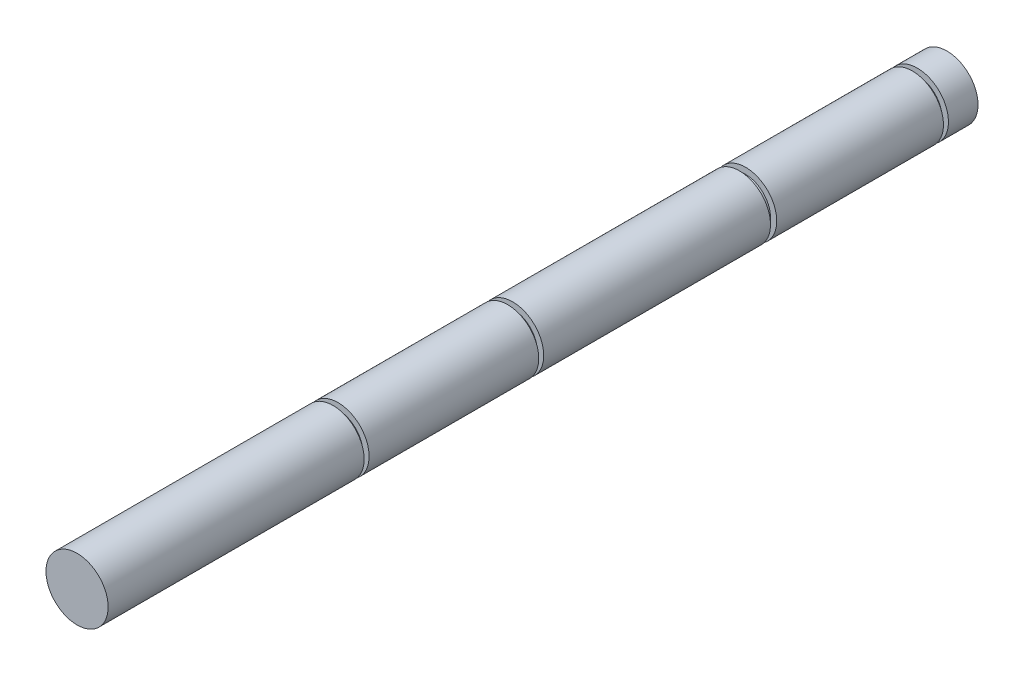
ISO-10303-21;
HEADER;
FILE_DESCRIPTION(('STEP AP214'),'2;1');
FILE_NAME('part.step','',(''),(''),'','','');
FILE_SCHEMA(('AUTOMOTIVE_DESIGN { 1 0 10303 214 1 1 1 1 }'));
ENDSEC;
DATA;
#1=APPLICATION_CONTEXT('core data for automotive mechanical design processes');
#2=APPLICATION_PROTOCOL_DEFINITION('international standard','automotive_design',2000,#1);
#3=PRODUCT_CONTEXT('',#1,'mechanical');
#4=PRODUCT('Part','Part','',(#3));
#5=PRODUCT_RELATED_PRODUCT_CATEGORY('part','',(#4));
#6=PRODUCT_DEFINITION_FORMATION('','',#4);
#7=PRODUCT_DEFINITION_CONTEXT('part definition',#1,'design');
#8=PRODUCT_DEFINITION('design','',#6,#7);
#9=PRODUCT_DEFINITION_SHAPE('','',#8);
#10=(LENGTH_UNIT() NAMED_UNIT(*) SI_UNIT(.MILLI.,.METRE.));
#11=(NAMED_UNIT(*) PLANE_ANGLE_UNIT() SI_UNIT($,.RADIAN.));
#12=(NAMED_UNIT(*) SI_UNIT($,.STERADIAN.) SOLID_ANGLE_UNIT());
#13=UNCERTAINTY_MEASURE_WITH_UNIT(LENGTH_MEASURE(1.E-05),#10,'distance_accuracy_value','');
#14=(GEOMETRIC_REPRESENTATION_CONTEXT(3) GLOBAL_UNCERTAINTY_ASSIGNED_CONTEXT((#13)) GLOBAL_UNIT_ASSIGNED_CONTEXT((#10,
#11,#12)) REPRESENTATION_CONTEXT('',''));
#15=CARTESIAN_POINT('',(0.,0.,0.));
#16=DIRECTION('',(0.,0.,1.));
#17=DIRECTION('',(1.,0.,0.));
#18=AXIS2_PLACEMENT_3D('',#15,#16,#17);
#19=CARTESIAN_POINT('',(0.,0.,135.));
#20=DIRECTION('',(0.,0.,-1.));
#21=DIRECTION('',(-1.,0.,0.));
#22=AXIS2_PLACEMENT_3D('',#19,#20,#21);
#23=CYLINDRICAL_SURFACE('',#22,5.);
#24=CARTESIAN_POINT('',(0.,0.,64.9));
#25=DIRECTION('',(0.,0.,-1.));
#26=DIRECTION('',(-1.,0.,0.));
#27=AXIS2_PLACEMENT_3D('',#24,#25,#26);
#28=CIRCLE('',#27,5.);
#29=CARTESIAN_POINT('',(-5.,0.,64.9));
#30=VERTEX_POINT('',#29);
#31=EDGE_CURVE('E68',#30,#30,#28,.T.);
#32=ORIENTED_EDGE('',*,*,#31,.T.);
#33=EDGE_LOOP('',(#32));
#34=FACE_BOUND('',#33,.T.);
#35=CARTESIAN_POINT('',(2.55336168158573E-12,9.43764535068018E-13,28.3999999999994));
#36=DIRECTION('',(0.,0.,-1.));
#37=DIRECTION('',(-1.,0.,0.));
#38=AXIS2_PLACEMENT_3D('',#35,#36,#37);
#39=CIRCLE('',#38,4.99999999997957);
#40=CARTESIAN_POINT('',(-4.99999999997702,9.43764535068018E-13,28.3999999999994));
#41=VERTEX_POINT('',#40);
#42=EDGE_CURVE('E89',#41,#41,#39,.T.);
#43=ORIENTED_EDGE('',*,*,#42,.F.);
#44=EDGE_LOOP('',(#43));
#45=FACE_BOUND('',#44,.T.);
#46=ADVANCED_FACE('F37',(#34,#45),#23,.T.);
#47=CARTESIAN_POINT('',(-5.,0.,65.7));
#48=DIRECTION('',(0.,0.,1.));
#49=DIRECTION('',(1.,0.,0.));
#50=AXIS2_PLACEMENT_3D('',#47,#48,#49);
#51=PLANE('',#50);
#52=CARTESIAN_POINT('',(0.,0.,65.7));
#53=DIRECTION('',(0.,0.,-1.));
#54=DIRECTION('',(-1.,0.,0.));
#55=AXIS2_PLACEMENT_3D('',#52,#53,#54);
#56=CIRCLE('',#55,4.);
#57=CARTESIAN_POINT('',(-4.,0.,65.7));
#58=VERTEX_POINT('',#57);
#59=EDGE_CURVE('E48',#58,#58,#56,.T.);
#60=ORIENTED_EDGE('',*,*,#59,.F.);
#61=EDGE_LOOP('',(#60));
#62=FACE_BOUND('',#61,.T.);
#63=CARTESIAN_POINT('',(0.,0.,65.7));
#64=DIRECTION('',(0.,0.,-1.));
#65=DIRECTION('',(-1.,0.,0.));
#66=AXIS2_PLACEMENT_3D('',#63,#64,#65);
#67=CIRCLE('',#66,5.);
#68=CARTESIAN_POINT('',(-5.,0.,65.7));
#69=VERTEX_POINT('',#68);
#70=EDGE_CURVE('E44',#69,#69,#67,.T.);
#71=ORIENTED_EDGE('',*,*,#70,.T.);
#72=EDGE_LOOP('',(#71));
#73=FACE_BOUND('',#72,.T.);
#74=ADVANCED_FACE('F115',(#62,#73),#51,.F.);
#75=CARTESIAN_POINT('',(0.,0.,6.05055330366506));
#76=DIRECTION('',(0.,0.,-1.));
#77=DIRECTION('',(-1.,0.,0.));
#78=AXIS2_PLACEMENT_3D('',#75,#76,#77);
#79=CYLINDRICAL_SURFACE('',#78,4.);
#80=CARTESIAN_POINT('',(0.,0.,64.9));
#81=DIRECTION('',(0.,0.,-1.));
#82=DIRECTION('',(-1.,0.,0.));
#83=AXIS2_PLACEMENT_3D('',#80,#81,#82);
#84=CIRCLE('',#83,4.);
#85=CARTESIAN_POINT('',(-4.,0.,64.9));
#86=VERTEX_POINT('',#85);
#87=EDGE_CURVE('E53',#86,#86,#84,.T.);
#88=ORIENTED_EDGE('',*,*,#87,.F.);
#89=EDGE_LOOP('',(#88));
#90=FACE_BOUND('',#89,.T.);
#91=ORIENTED_EDGE('',*,*,#59,.T.);
#92=EDGE_LOOP('',(#91));
#93=FACE_BOUND('',#92,.T.);
#94=ADVANCED_FACE('F122',(#90,#93),#79,.T.);
#95=CARTESIAN_POINT('',(-5.,0.,64.9));
#96=DIRECTION('',(0.,0.,-1.));
#97=DIRECTION('',(-1.,0.,0.));
#98=AXIS2_PLACEMENT_3D('',#95,#96,#97);
#99=PLANE('',#98);
#100=ORIENTED_EDGE('',*,*,#31,.F.);
#101=EDGE_LOOP('',(#100));
#102=FACE_BOUND('',#101,.T.);
#103=ORIENTED_EDGE('',*,*,#87,.T.);
#104=EDGE_LOOP('',(#103));
#105=FACE_BOUND('',#104,.T.);
#106=ADVANCED_FACE('F157',(#102,#105),#99,.F.);
#107=ORIENTED_EDGE('',*,*,#70,.F.);
#108=EDGE_LOOP('',(#107));
#109=FACE_BOUND('',#108,.T.);
#110=CARTESIAN_POINT('',(0.,0.,93.));
#111=DIRECTION('',(0.,0.,-1.));
#112=DIRECTION('',(-1.,0.,0.));
#113=AXIS2_PLACEMENT_3D('',#110,#111,#112);
#114=CIRCLE('',#113,4.99999999999972);
#115=CARTESIAN_POINT('',(-4.99999999999972,0.,93.));
#116=VERTEX_POINT('',#115);
#117=EDGE_CURVE('E57',#116,#116,#114,.T.);
#118=ORIENTED_EDGE('',*,*,#117,.T.);
#119=EDGE_LOOP('',(#118));
#120=FACE_BOUND('',#119,.T.);
#121=ADVANCED_FACE('F128',(#109,#120),#23,.T.);
#122=CARTESIAN_POINT('',(-4.99999999999972,0.,93.));
#123=DIRECTION('',(0.,0.,-1.));
#124=DIRECTION('',(-1.,0.,0.));
#125=AXIS2_PLACEMENT_3D('',#122,#123,#124);
#126=PLANE('',#125);
#127=ORIENTED_EDGE('',*,*,#117,.F.);
#128=EDGE_LOOP('',(#127));
#129=FACE_BOUND('',#128,.T.);
#130=CARTESIAN_POINT('',(0.,0.,93.));
#131=DIRECTION('',(0.,0.,-1.));
#132=DIRECTION('',(-1.,0.,0.));
#133=AXIS2_PLACEMENT_3D('',#130,#131,#132);
#134=CIRCLE('',#133,3.99999999999971);
#135=CARTESIAN_POINT('',(-3.99999999999971,0.,93.));
#136=VERTEX_POINT('',#135);
#137=EDGE_CURVE('E66',#136,#136,#134,.T.);
#138=ORIENTED_EDGE('',*,*,#137,.T.);
#139=EDGE_LOOP('',(#138));
#140=FACE_BOUND('',#139,.T.);
#141=ADVANCED_FACE('F156',(#129,#140),#126,.F.);
#142=CARTESIAN_POINT('',(0.,0.,6.05055330366506));
#143=DIRECTION('',(0.,0.,-1.));
#144=DIRECTION('',(-1.,0.,0.));
#145=AXIS2_PLACEMENT_3D('',#142,#143,#144);
#146=CYLINDRICAL_SURFACE('',#145,3.99999999999971);
#147=ORIENTED_EDGE('',*,*,#137,.F.);
#148=EDGE_LOOP('',(#147));
#149=FACE_BOUND('',#148,.T.);
#150=CARTESIAN_POINT('',(0.,0.,93.8));
#151=DIRECTION('',(0.,0.,-1.));
#152=DIRECTION('',(-1.,0.,0.));
#153=AXIS2_PLACEMENT_3D('',#150,#151,#152);
#154=CIRCLE('',#153,3.99999999999971);
#155=CARTESIAN_POINT('',(-3.99999999999971,0.,93.8));
#156=VERTEX_POINT('',#155);
#157=EDGE_CURVE('E64',#156,#156,#154,.T.);
#158=ORIENTED_EDGE('',*,*,#157,.T.);
#159=EDGE_LOOP('',(#158));
#160=FACE_BOUND('',#159,.T.);
#161=ADVANCED_FACE('F164',(#149,#160),#146,.T.);
#162=CARTESIAN_POINT('',(-5.,0.,93.8));
#163=DIRECTION('',(0.,0.,1.));
#164=DIRECTION('',(1.,0.,0.));
#165=AXIS2_PLACEMENT_3D('',#162,#163,#164);
#166=PLANE('',#165);
#167=ORIENTED_EDGE('',*,*,#157,.F.);
#168=EDGE_LOOP('',(#167));
#169=FACE_BOUND('',#168,.T.);
#170=CARTESIAN_POINT('',(0.,0.,93.8));
#171=DIRECTION('',(0.,0.,-1.));
#172=DIRECTION('',(-1.,0.,0.));
#173=AXIS2_PLACEMENT_3D('',#170,#171,#172);
#174=CIRCLE('',#173,5.);
#175=CARTESIAN_POINT('',(-5.,0.,93.8));
#176=VERTEX_POINT('',#175);
#177=EDGE_CURVE('E60',#176,#176,#174,.T.);
#178=ORIENTED_EDGE('',*,*,#177,.T.);
#179=EDGE_LOOP('',(#178));
#180=FACE_BOUND('',#179,.T.);
#181=ADVANCED_FACE('F138',(#169,#180),#166,.F.);
#182=CARTESIAN_POINT('',(0.,0.,135.));
#183=DIRECTION('',(0.,0.,1.));
#184=DIRECTION('',(1.,0.,0.));
#185=AXIS2_PLACEMENT_3D('',#182,#183,#184);
#186=PLANE('',#185);
#187=CARTESIAN_POINT('',(0.,0.,135.));
#188=DIRECTION('',(0.,0.,1.));
#189=DIRECTION('',(1.,0.,0.));
#190=AXIS2_PLACEMENT_3D('',#187,#188,#189);
#191=CIRCLE('',#190,5.);
#192=CARTESIAN_POINT('',(5.,0.,135.));
#193=VERTEX_POINT('',#192);
#194=EDGE_CURVE('E10',#193,#193,#191,.T.);
#195=ORIENTED_EDGE('',*,*,#194,.T.);
#196=EDGE_LOOP('',(#195));
#197=FACE_BOUND('',#196,.T.);
#198=ADVANCED_FACE('F130',(#197),#186,.T.);
#199=ORIENTED_EDGE('',*,*,#177,.F.);
#200=EDGE_LOOP('',(#199));
#201=FACE_BOUND('',#200,.T.);
#202=ORIENTED_EDGE('',*,*,#194,.F.);
#203=EDGE_LOOP('',(#202));
#204=FACE_BOUND('',#203,.T.);
#205=ADVANCED_FACE('F39',(#201,#204),#23,.T.);
#206=CARTESIAN_POINT('',(2.55336168158573E-12,9.43764535068018E-13,28.3999999999994));
#207=DIRECTION('',(0.,0.,-1.));
#208=DIRECTION('',(-1.,0.,0.));
#209=AXIS2_PLACEMENT_3D('',#206,#207,#208);
#210=PLANE('',#209);
#211=CARTESIAN_POINT('',(2.55336168158573E-12,9.43764535068018E-13,28.3999999999994));
#212=DIRECTION('',(0.,0.,-1.));
#213=DIRECTION('',(-1.,0.,0.));
#214=AXIS2_PLACEMENT_3D('',#211,#212,#213);
#215=CIRCLE('',#214,3.99999999998788);
#216=CARTESIAN_POINT('',(-3.99999999998533,9.43764535068018E-13,28.3999999999994));
#217=VERTEX_POINT('',#216);
#218=EDGE_CURVE('E95',#217,#217,#215,.T.);
#219=ORIENTED_EDGE('',*,*,#218,.F.);
#220=EDGE_LOOP('',(#219));
#221=FACE_BOUND('',#220,.T.);
#222=ORIENTED_EDGE('',*,*,#42,.T.);
#223=EDGE_LOOP('',(#222));
#224=FACE_BOUND('',#223,.T.);
#225=ADVANCED_FACE('F107',(#221,#224),#210,.T.);
#226=CARTESIAN_POINT('',(2.55351295663786E-12,9.43689570931383E-13,27.3999999999994));
#227=DIRECTION('',(0.,0.,-1.));
#228=DIRECTION('',(-1.,0.,0.));
#229=AXIS2_PLACEMENT_3D('',#226,#227,#228);
#230=PLANE('',#229);
#231=CARTESIAN_POINT('',(2.55351295663786E-12,9.43689570931383E-13,27.3999999999994));
#232=DIRECTION('',(0.,0.,-1.));
#233=DIRECTION('',(-1.,0.,0.));
#234=AXIS2_PLACEMENT_3D('',#231,#232,#233);
#235=CIRCLE('',#234,3.99999999998788);
#236=CARTESIAN_POINT('',(-3.99999999998533,9.43689570931383E-13,27.3999999999994));
#237=VERTEX_POINT('',#236);
#238=EDGE_CURVE('E98',#237,#237,#235,.T.);
#239=ORIENTED_EDGE('',*,*,#238,.T.);
#240=EDGE_LOOP('',(#239));
#241=FACE_BOUND('',#240,.T.);
#242=CARTESIAN_POINT('',(2.55351295663786E-12,9.43689570931383E-13,27.3999999999994));
#243=DIRECTION('',(0.,0.,-1.));
#244=DIRECTION('',(-1.,0.,0.));
#245=AXIS2_PLACEMENT_3D('',#242,#243,#244);
#246=CIRCLE('',#245,4.99999999997957);
#247=CARTESIAN_POINT('',(-4.99999999997702,9.43689570931383E-13,27.3999999999994));
#248=VERTEX_POINT('',#247);
#249=EDGE_CURVE('E92',#248,#248,#246,.T.);
#250=ORIENTED_EDGE('',*,*,#249,.F.);
#251=EDGE_LOOP('',(#250));
#252=FACE_BOUND('',#251,.T.);
#253=ADVANCED_FACE('F110',(#241,#252),#230,.F.);
#254=CARTESIAN_POINT('',(2.55336168158573E-12,9.43764535068018E-13,28.3999999999994));
#255=DIRECTION('',(0.,0.,-1.));
#256=DIRECTION('',(-1.,0.,0.));
#257=AXIS2_PLACEMENT_3D('',#254,#255,#256);
#258=CYLINDRICAL_SURFACE('',#257,3.99999999998788);
#259=ORIENTED_EDGE('',*,*,#218,.T.);
#260=EDGE_LOOP('',(#259));
#261=FACE_BOUND('',#260,.T.);
#262=ORIENTED_EDGE('',*,*,#238,.F.);
#263=EDGE_LOOP('',(#262));
#264=FACE_BOUND('',#263,.T.);
#265=ADVANCED_FACE('F104',(#261,#264),#258,.T.);
#266=CARTESIAN_POINT('',(0.,0.,-5.));
#267=DIRECTION('',(0.,0.,-1.));
#268=DIRECTION('',(-1.,0.,0.));
#269=AXIS2_PLACEMENT_3D('',#266,#267,#268);
#270=PLANE('',#269);
#271=CARTESIAN_POINT('',(0.,0.,-5.));
#272=DIRECTION('',(0.,0.,-1.));
#273=DIRECTION('',(-1.,0.,0.));
#274=AXIS2_PLACEMENT_3D('',#271,#272,#273);
#275=CIRCLE('',#274,5.);
#276=CARTESIAN_POINT('',(-5.,0.,-5.));
#277=VERTEX_POINT('',#276);
#278=EDGE_CURVE('E61',#277,#277,#275,.T.);
#279=ORIENTED_EDGE('',*,*,#278,.T.);
#280=EDGE_LOOP('',(#279));
#281=FACE_BOUND('',#280,.T.);
#282=ADVANCED_FACE('F142',(#281),#270,.T.);
#283=CARTESIAN_POINT('',(2.55351295663786E-12,9.43689570931383E-13,-0.235000000000596));
#284=DIRECTION('',(0.,0.,-1.));
#285=DIRECTION('',(-1.,0.,0.));
#286=AXIS2_PLACEMENT_3D('',#283,#284,#285);
#287=CIRCLE('',#286,4.99999999997908);
#288=CARTESIAN_POINT('',(-4.99999999997652,9.43689570931383E-13,-0.235000000000596));
#289=VERTEX_POINT('',#288);
#290=EDGE_CURVE('E80',#289,#289,#287,.T.);
#291=ORIENTED_EDGE('',*,*,#290,.T.);
#292=EDGE_LOOP('',(#291));
#293=FACE_BOUND('',#292,.T.);
#294=ORIENTED_EDGE('',*,*,#278,.F.);
#295=EDGE_LOOP('',(#294));
#296=FACE_BOUND('',#295,.T.);
#297=ADVANCED_FACE('F132',(#293,#296),#23,.T.);
#298=CARTESIAN_POINT('',(2.55351295663786E-12,9.43689570931383E-13,-0.235000000000596));
#299=DIRECTION('',(0.,0.,-1.));
#300=DIRECTION('',(-1.,0.,0.));
#301=AXIS2_PLACEMENT_3D('',#298,#299,#300);
#302=PLANE('',#301);
#303=CARTESIAN_POINT('',(2.55351295663786E-12,9.43689570931383E-13,-0.235000000000596));
#304=DIRECTION('',(0.,0.,-1.));
#305=DIRECTION('',(-1.,0.,0.));
#306=AXIS2_PLACEMENT_3D('',#303,#304,#305);
#307=CIRCLE('',#306,3.99999999998788);
#308=CARTESIAN_POINT('',(-3.99999999998533,9.43689570931383E-13,-0.235000000000596));
#309=VERTEX_POINT('',#308);
#310=EDGE_CURVE('E86',#309,#309,#307,.T.);
#311=ORIENTED_EDGE('',*,*,#310,.T.);
#312=EDGE_LOOP('',(#311));
#313=FACE_BOUND('',#312,.T.);
#314=ORIENTED_EDGE('',*,*,#290,.F.);
#315=EDGE_LOOP('',(#314));
#316=FACE_BOUND('',#315,.T.);
#317=ADVANCED_FACE('F141',(#313,#316),#302,.F.);
#318=CARTESIAN_POINT('',(2.55351295663786E-12,9.43689570931383E-13,0.564999999999404));
#319=DIRECTION('',(0.,0.,-1.));
#320=DIRECTION('',(-1.,0.,0.));
#321=AXIS2_PLACEMENT_3D('',#318,#319,#320);
#322=CYLINDRICAL_SURFACE('',#321,3.99999999998788);
#323=CARTESIAN_POINT('',(2.55351295663786E-12,9.43689570931383E-13,0.564999999999404));
#324=DIRECTION('',(0.,0.,-1.));
#325=DIRECTION('',(-1.,0.,0.));
#326=AXIS2_PLACEMENT_3D('',#323,#324,#325);
#327=CIRCLE('',#326,3.99999999998788);
#328=CARTESIAN_POINT('',(-3.99999999998533,9.43689570931383E-13,0.564999999999404));
#329=VERTEX_POINT('',#328);
#330=EDGE_CURVE('E83',#329,#329,#327,.T.);
#331=ORIENTED_EDGE('',*,*,#330,.T.);
#332=EDGE_LOOP('',(#331));
#333=FACE_BOUND('',#332,.T.);
#334=ORIENTED_EDGE('',*,*,#310,.F.);
#335=EDGE_LOOP('',(#334));
#336=FACE_BOUND('',#335,.T.);
#337=ADVANCED_FACE('F148',(#333,#336),#322,.T.);
#338=CARTESIAN_POINT('',(2.55351295663786E-12,9.43689570931383E-13,0.564999999999404));
#339=DIRECTION('',(0.,0.,-1.));
#340=DIRECTION('',(-1.,0.,0.));
#341=AXIS2_PLACEMENT_3D('',#338,#339,#340);
#342=PLANE('',#341);
#343=ORIENTED_EDGE('',*,*,#330,.F.);
#344=EDGE_LOOP('',(#343));
#345=FACE_BOUND('',#344,.T.);
#346=CARTESIAN_POINT('',(2.55351295663786E-12,9.43689570931383E-13,0.564999999999404));
#347=DIRECTION('',(0.,0.,-1.));
#348=DIRECTION('',(-1.,0.,0.));
#349=AXIS2_PLACEMENT_3D('',#346,#347,#348);
#350=CIRCLE('',#349,4.99999999997908);
#351=CARTESIAN_POINT('',(-4.99999999997652,9.43689570931383E-13,0.564999999999404));
#352=VERTEX_POINT('',#351);
#353=EDGE_CURVE('E79',#352,#352,#350,.T.);
#354=ORIENTED_EDGE('',*,*,#353,.T.);
#355=EDGE_LOOP('',(#354));
#356=FACE_BOUND('',#355,.T.);
#357=ADVANCED_FACE('F126',(#345,#356),#342,.T.);
#358=ORIENTED_EDGE('',*,*,#249,.T.);
#359=EDGE_LOOP('',(#358));
#360=FACE_BOUND('',#359,.T.);
#361=ORIENTED_EDGE('',*,*,#353,.F.);
#362=EDGE_LOOP('',(#361));
#363=FACE_BOUND('',#362,.T.);
#364=ADVANCED_FACE('F116',(#360,#363),#23,.T.);
#365=CLOSED_SHELL('',(#46,#74,#94,#106,#121,#141,#161,#181,#198,#205,#225,#253,#265,#282,#297,
#317,#337,#357,#364));
#366=MANIFOLD_SOLID_BREP('B2',#365);
#367=ADVANCED_BREP_SHAPE_REPRESENTATION('',(#18,#366),#14);
#368=SHAPE_DEFINITION_REPRESENTATION(#9,#367);
ENDSEC;
END-ISO-10303-21;
